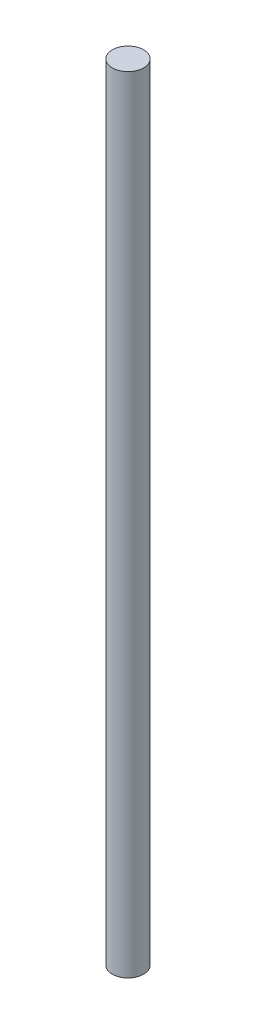
ISO-10303-21;
HEADER;
FILE_DESCRIPTION(('STEP AP214'),'2;1');
FILE_NAME('part.step','',(''),(''),'','','');
FILE_SCHEMA(('AUTOMOTIVE_DESIGN { 1 0 10303 214 1 1 1 1 }'));
ENDSEC;
DATA;
#1=APPLICATION_CONTEXT('core data for automotive mechanical design processes');
#2=APPLICATION_PROTOCOL_DEFINITION('international standard','automotive_design',2000,#1);
#3=PRODUCT_CONTEXT('',#1,'mechanical');
#4=PRODUCT('Part','Part','',(#3));
#5=PRODUCT_RELATED_PRODUCT_CATEGORY('part','',(#4));
#6=PRODUCT_DEFINITION_FORMATION('','',#4);
#7=PRODUCT_DEFINITION_CONTEXT('part definition',#1,'design');
#8=PRODUCT_DEFINITION('design','',#6,#7);
#9=PRODUCT_DEFINITION_SHAPE('','',#8);
#10=(LENGTH_UNIT() NAMED_UNIT(*) SI_UNIT(.MILLI.,.METRE.));
#11=(NAMED_UNIT(*) PLANE_ANGLE_UNIT() SI_UNIT($,.RADIAN.));
#12=(NAMED_UNIT(*) SI_UNIT($,.STERADIAN.) SOLID_ANGLE_UNIT());
#13=UNCERTAINTY_MEASURE_WITH_UNIT(LENGTH_MEASURE(1.E-05),#10,'distance_accuracy_value','');
#14=(GEOMETRIC_REPRESENTATION_CONTEXT(3) GLOBAL_UNCERTAINTY_ASSIGNED_CONTEXT((#13)) GLOBAL_UNIT_ASSIGNED_CONTEXT((#10,
#11,#12)) REPRESENTATION_CONTEXT('',''));
#15=CARTESIAN_POINT('',(0.,0.,0.));
#16=DIRECTION('',(0.,0.,1.));
#17=DIRECTION('',(1.,0.,0.));
#18=AXIS2_PLACEMENT_3D('',#15,#16,#17);
#19=CARTESIAN_POINT('',(0.,75.,0.));
#20=DIRECTION('',(0.,-1.,0.));
#21=DIRECTION('',(0.,0.,-1.));
#22=AXIS2_PLACEMENT_3D('',#19,#20,#21);
#23=CYLINDRICAL_SURFACE('',#22,1.5);
#24=CARTESIAN_POINT('',(0.,75.,0.));
#25=DIRECTION('',(0.,1.,0.));
#26=DIRECTION('',(0.,0.,1.));
#27=AXIS2_PLACEMENT_3D('',#24,#25,#26);
#28=CIRCLE('',#27,1.5);
#29=CARTESIAN_POINT('',(0.,75.,1.5));
#30=VERTEX_POINT('',#29);
#31=EDGE_CURVE('E10',#30,#30,#28,.T.);
#32=ORIENTED_EDGE('',*,*,#31,.F.);
#33=EDGE_LOOP('',(#32));
#34=FACE_BOUND('',#33,.T.);
#35=CARTESIAN_POINT('',(0.,0.,0.));
#36=DIRECTION('',(0.,1.,0.));
#37=DIRECTION('',(0.,0.,1.));
#38=AXIS2_PLACEMENT_3D('',#35,#36,#37);
#39=CIRCLE('',#38,1.5);
#40=CARTESIAN_POINT('',(0.,0.,1.5));
#41=VERTEX_POINT('',#40);
#42=EDGE_CURVE('E38',#41,#41,#39,.T.);
#43=ORIENTED_EDGE('',*,*,#42,.T.);
#44=EDGE_LOOP('',(#43));
#45=FACE_BOUND('',#44,.T.);
#46=ADVANCED_FACE('F35',(#34,#45),#23,.T.);
#47=CARTESIAN_POINT('',(0.,75.,0.));
#48=DIRECTION('',(0.,1.,0.));
#49=DIRECTION('',(0.,0.,1.));
#50=AXIS2_PLACEMENT_3D('',#47,#48,#49);
#51=PLANE('',#50);
#52=ORIENTED_EDGE('',*,*,#31,.T.);
#53=EDGE_LOOP('',(#52));
#54=FACE_BOUND('',#53,.T.);
#55=ADVANCED_FACE('F50',(#54),#51,.T.);
#56=CARTESIAN_POINT('',(0.,0.,0.));
#57=DIRECTION('',(0.,1.,0.));
#58=DIRECTION('',(0.,0.,1.));
#59=AXIS2_PLACEMENT_3D('',#56,#57,#58);
#60=PLANE('',#59);
#61=ORIENTED_EDGE('',*,*,#42,.F.);
#62=EDGE_LOOP('',(#61));
#63=FACE_BOUND('',#62,.T.);
#64=ADVANCED_FACE('F48',(#63),#60,.F.);
#65=CLOSED_SHELL('',(#46,#55,#64));
#66=MANIFOLD_SOLID_BREP('B2',#65);
#67=ADVANCED_BREP_SHAPE_REPRESENTATION('',(#18,#66),#14);
#68=SHAPE_DEFINITION_REPRESENTATION(#9,#67);
ENDSEC;
END-ISO-10303-21;
